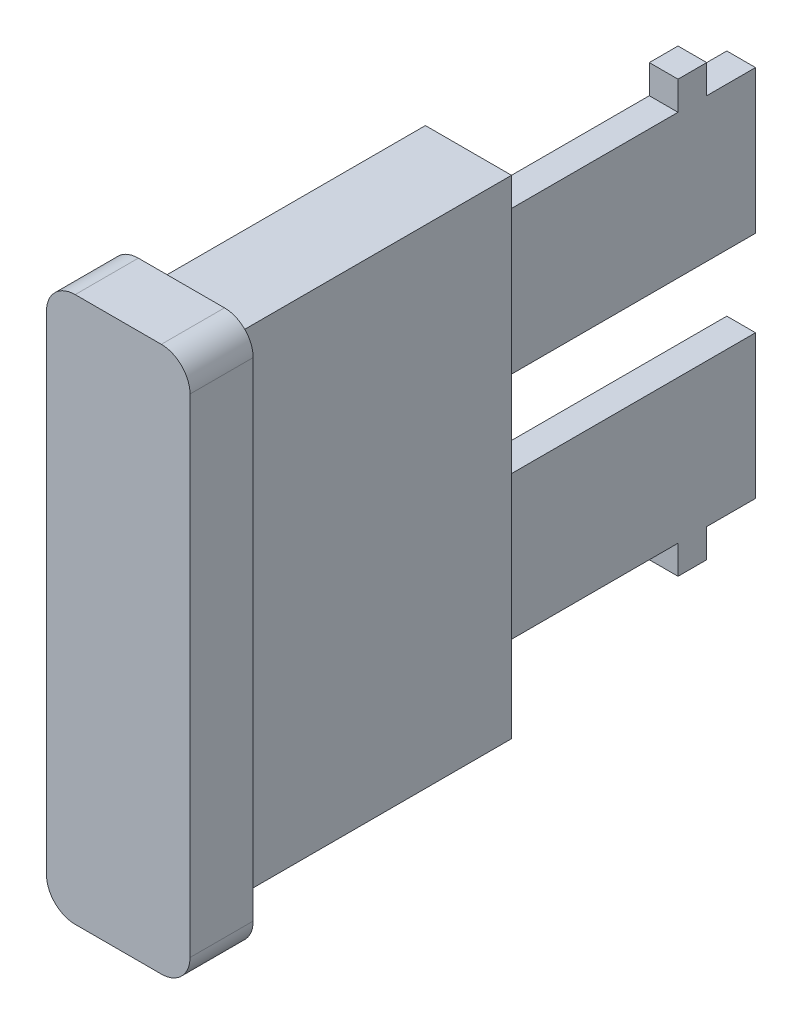
ISO-10303-21;
HEADER;
FILE_DESCRIPTION(('STEP AP214'),'2;1');
FILE_NAME('part.step','',(''),(''),'','','');
FILE_SCHEMA(('AUTOMOTIVE_DESIGN { 1 0 10303 214 1 1 1 1 }'));
ENDSEC;
DATA;
#1=APPLICATION_CONTEXT('core data for automotive mechanical design processes');
#2=APPLICATION_PROTOCOL_DEFINITION('international standard','automotive_design',2000,#1);
#3=PRODUCT_CONTEXT('',#1,'mechanical');
#4=PRODUCT('Part','Part','',(#3));
#5=PRODUCT_RELATED_PRODUCT_CATEGORY('part','',(#4));
#6=PRODUCT_DEFINITION_FORMATION('','',#4);
#7=PRODUCT_DEFINITION_CONTEXT('part definition',#1,'design');
#8=PRODUCT_DEFINITION('design','',#6,#7);
#9=PRODUCT_DEFINITION_SHAPE('','',#8);
#10=(LENGTH_UNIT() NAMED_UNIT(*) SI_UNIT(.MILLI.,.METRE.));
#11=(NAMED_UNIT(*) PLANE_ANGLE_UNIT() SI_UNIT($,.RADIAN.));
#12=(NAMED_UNIT(*) SI_UNIT($,.STERADIAN.) SOLID_ANGLE_UNIT());
#13=UNCERTAINTY_MEASURE_WITH_UNIT(LENGTH_MEASURE(1.E-05),#10,'distance_accuracy_value','');
#14=(GEOMETRIC_REPRESENTATION_CONTEXT(3) GLOBAL_UNCERTAINTY_ASSIGNED_CONTEXT((#13)) GLOBAL_UNIT_ASSIGNED_CONTEXT((#10,
#11,#12)) REPRESENTATION_CONTEXT('',''));
#15=CARTESIAN_POINT('',(0.,0.,0.));
#16=DIRECTION('',(0.,0.,1.));
#17=DIRECTION('',(1.,0.,0.));
#18=AXIS2_PLACEMENT_3D('',#15,#16,#17);
#19=CARTESIAN_POINT('',(-83.4015195369031,-101.205426917511,19.0000000000006));
#20=DIRECTION('',(0.,0.,1.));
#21=DIRECTION('',(1.,0.,0.));
#22=AXIS2_PLACEMENT_3D('',#19,#20,#21);
#23=CYLINDRICAL_SURFACE('',#22,1.);
#24=CARTESIAN_POINT('',(-83.4015195369031,-101.205426917511,16.8000000000006));
#25=DIRECTION('',(0.,0.,1.));
#26=DIRECTION('',(1.,0.,0.));
#27=AXIS2_PLACEMENT_3D('',#24,#25,#26);
#28=CIRCLE('',#27,1.);
#29=CARTESIAN_POINT('',(-82.4015195369031,-101.205426917511,16.8000000000006));
#30=VERTEX_POINT('',#29);
#31=CARTESIAN_POINT('',(-83.4015195369031,-100.205426917511,16.8000000000006));
#32=VERTEX_POINT('',#31);
#33=EDGE_CURVE('E20',#30,#32,#28,.T.);
#34=ORIENTED_EDGE('',*,*,#33,.T.);
#35=DIRECTION('',(0.,0.,-1.));
#36=VECTOR('',#35,1.);
#37=CARTESIAN_POINT('',(-83.4015195369031,-100.205426917511,19.0000000000006));
#38=LINE('',#37,#36);
#39=CARTESIAN_POINT('',(-83.4015195369031,-100.205426917511,19.0000000000006));
#40=VERTEX_POINT('',#39);
#41=EDGE_CURVE('E203',#32,#40,#38,.F.);
#42=ORIENTED_EDGE('',*,*,#41,.T.);
#43=CARTESIAN_POINT('',(-83.4015195369031,-101.205426917511,19.0000000000006));
#44=DIRECTION('',(0.,0.,1.));
#45=DIRECTION('',(1.,0.,0.));
#46=AXIS2_PLACEMENT_3D('',#43,#44,#45);
#47=CIRCLE('',#46,1.);
#48=CARTESIAN_POINT('',(-82.4015195369031,-101.205426917511,19.0000000000006));
#49=VERTEX_POINT('',#48);
#50=EDGE_CURVE('E370',#49,#40,#47,.T.);
#51=ORIENTED_EDGE('',*,*,#50,.F.);
#52=DIRECTION('',(0.,0.,1.));
#53=VECTOR('',#52,1.);
#54=CARTESIAN_POINT('',(-82.4015195369031,-101.205426917511,19.0000000000006));
#55=LINE('',#54,#53);
#56=EDGE_CURVE('E206',#49,#30,#55,.F.);
#57=ORIENTED_EDGE('',*,*,#56,.T.);
#58=EDGE_LOOP('',(#34,#42,#51,#57));
#59=FACE_BOUND('',#58,.T.);
#60=ADVANCED_FACE('F17',(#59),#23,.T.);
#61=CARTESIAN_POINT('',(-86.4015195369031,-101.205426917511,19.0000000000006));
#62=DIRECTION('',(0.,0.,1.));
#63=DIRECTION('',(1.,0.,0.));
#64=AXIS2_PLACEMENT_3D('',#61,#62,#63);
#65=CYLINDRICAL_SURFACE('',#64,1.);
#66=CARTESIAN_POINT('',(-86.4015195369031,-101.205426917511,16.8000000000006));
#67=DIRECTION('',(0.,0.,1.));
#68=DIRECTION('',(1.,0.,0.));
#69=AXIS2_PLACEMENT_3D('',#66,#67,#68);
#70=CIRCLE('',#69,1.);
#71=CARTESIAN_POINT('',(-86.4015195369031,-100.205426917511,16.8000000000006));
#72=VERTEX_POINT('',#71);
#73=CARTESIAN_POINT('',(-87.4015195369031,-101.205426917511,16.8000000000006));
#74=VERTEX_POINT('',#73);
#75=EDGE_CURVE('E208',#72,#74,#70,.T.);
#76=ORIENTED_EDGE('',*,*,#75,.T.);
#77=DIRECTION('',(0.,0.,-1.));
#78=VECTOR('',#77,1.);
#79=CARTESIAN_POINT('',(-87.4015195369031,-101.205426917511,19.0000000000006));
#80=LINE('',#79,#78);
#81=CARTESIAN_POINT('',(-87.4015195369031,-101.205426917511,19.0000000000006));
#82=VERTEX_POINT('',#81);
#83=EDGE_CURVE('E310',#74,#82,#80,.F.);
#84=ORIENTED_EDGE('',*,*,#83,.T.);
#85=CARTESIAN_POINT('',(-86.4015195369031,-101.205426917511,19.0000000000006));
#86=DIRECTION('',(0.,0.,1.));
#87=DIRECTION('',(1.,0.,0.));
#88=AXIS2_PLACEMENT_3D('',#85,#86,#87);
#89=CIRCLE('',#88,1.);
#90=CARTESIAN_POINT('',(-86.4015195369031,-100.205426917511,19.0000000000006));
#91=VERTEX_POINT('',#90);
#92=EDGE_CURVE('E360',#91,#82,#89,.T.);
#93=ORIENTED_EDGE('',*,*,#92,.F.);
#94=DIRECTION('',(0.,0.,-1.));
#95=VECTOR('',#94,1.);
#96=CARTESIAN_POINT('',(-86.4015195369031,-100.205426917511,19.0000000000006));
#97=LINE('',#96,#95);
#98=EDGE_CURVE('E313',#91,#72,#97,.T.);
#99=ORIENTED_EDGE('',*,*,#98,.T.);
#100=EDGE_LOOP('',(#76,#84,#93,#99));
#101=FACE_BOUND('',#100,.T.);
#102=ADVANCED_FACE('F383',(#101),#65,.T.);
#103=CARTESIAN_POINT('',(-83.4015195369031,-118.205426917511,19.0000000000006));
#104=DIRECTION('',(0.,0.,1.));
#105=DIRECTION('',(1.,0.,0.));
#106=AXIS2_PLACEMENT_3D('',#103,#104,#105);
#107=CYLINDRICAL_SURFACE('',#106,1.);
#108=CARTESIAN_POINT('',(-83.4015195369031,-118.205426917511,16.8000000000006));
#109=DIRECTION('',(0.,0.,1.));
#110=DIRECTION('',(1.,0.,0.));
#111=AXIS2_PLACEMENT_3D('',#108,#109,#110);
#112=CIRCLE('',#111,1.);
#113=CARTESIAN_POINT('',(-83.4015195369031,-119.205426917511,16.8000000000006));
#114=VERTEX_POINT('',#113);
#115=CARTESIAN_POINT('',(-82.4015195369031,-118.205426917511,16.8000000000006));
#116=VERTEX_POINT('',#115);
#117=EDGE_CURVE('E380',#114,#116,#112,.T.);
#118=ORIENTED_EDGE('',*,*,#117,.T.);
#119=DIRECTION('',(0.,0.,1.));
#120=VECTOR('',#119,1.);
#121=CARTESIAN_POINT('',(-82.4015195369031,-118.205426917511,19.0000000000006));
#122=LINE('',#121,#120);
#123=CARTESIAN_POINT('',(-82.4015195369031,-118.205426917511,19.0000000000006));
#124=VERTEX_POINT('',#123);
#125=EDGE_CURVE('E317',#116,#124,#122,.T.);
#126=ORIENTED_EDGE('',*,*,#125,.T.);
#127=CARTESIAN_POINT('',(-83.4015195369031,-118.205426917511,19.0000000000006));
#128=DIRECTION('',(0.,0.,1.));
#129=DIRECTION('',(1.,0.,0.));
#130=AXIS2_PLACEMENT_3D('',#127,#128,#129);
#131=CIRCLE('',#130,1.);
#132=CARTESIAN_POINT('',(-83.4015195369031,-119.205426917511,19.0000000000006));
#133=VERTEX_POINT('',#132);
#134=EDGE_CURVE('E372',#133,#124,#131,.T.);
#135=ORIENTED_EDGE('',*,*,#134,.F.);
#136=DIRECTION('',(0.,0.,1.));
#137=VECTOR('',#136,1.);
#138=CARTESIAN_POINT('',(-83.4015195369031,-119.205426917511,19.0000000000006));
#139=LINE('',#138,#137);
#140=EDGE_CURVE('E306',#133,#114,#139,.F.);
#141=ORIENTED_EDGE('',*,*,#140,.T.);
#142=EDGE_LOOP('',(#118,#126,#135,#141));
#143=FACE_BOUND('',#142,.T.);
#144=ADVANCED_FACE('F402',(#143),#107,.T.);
#145=CARTESIAN_POINT('',(-86.4015195369031,-118.205426917511,19.0000000000006));
#146=DIRECTION('',(0.,0.,1.));
#147=DIRECTION('',(1.,0.,0.));
#148=AXIS2_PLACEMENT_3D('',#145,#146,#147);
#149=CYLINDRICAL_SURFACE('',#148,1.);
#150=CARTESIAN_POINT('',(-86.4015195369031,-118.205426917511,16.8000000000006));
#151=DIRECTION('',(0.,0.,1.));
#152=DIRECTION('',(1.,0.,0.));
#153=AXIS2_PLACEMENT_3D('',#150,#151,#152);
#154=CIRCLE('',#153,1.);
#155=CARTESIAN_POINT('',(-87.4015195369031,-118.205426917511,16.8000000000006));
#156=VERTEX_POINT('',#155);
#157=CARTESIAN_POINT('',(-86.4015195369031,-119.205426917511,16.8000000000006));
#158=VERTEX_POINT('',#157);
#159=EDGE_CURVE('E378',#156,#158,#154,.T.);
#160=ORIENTED_EDGE('',*,*,#159,.T.);
#161=DIRECTION('',(0.,0.,1.));
#162=VECTOR('',#161,1.);
#163=CARTESIAN_POINT('',(-86.4015195369031,-119.205426917511,19.0000000000006));
#164=LINE('',#163,#162);
#165=CARTESIAN_POINT('',(-86.4015195369031,-119.205426917511,19.0000000000006));
#166=VERTEX_POINT('',#165);
#167=EDGE_CURVE('E304',#158,#166,#164,.T.);
#168=ORIENTED_EDGE('',*,*,#167,.T.);
#169=CARTESIAN_POINT('',(-86.4015195369031,-118.205426917511,19.0000000000006));
#170=DIRECTION('',(0.,0.,1.));
#171=DIRECTION('',(1.,0.,0.));
#172=AXIS2_PLACEMENT_3D('',#169,#170,#171);
#173=CIRCLE('',#172,1.);
#174=CARTESIAN_POINT('',(-87.4015195369031,-118.205426917511,19.0000000000006));
#175=VERTEX_POINT('',#174);
#176=EDGE_CURVE('E375',#175,#166,#173,.T.);
#177=ORIENTED_EDGE('',*,*,#176,.F.);
#178=DIRECTION('',(0.,0.,-1.));
#179=VECTOR('',#178,1.);
#180=CARTESIAN_POINT('',(-87.4015195369031,-118.205426917511,19.0000000000006));
#181=LINE('',#180,#179);
#182=EDGE_CURVE('E309',#175,#156,#181,.T.);
#183=ORIENTED_EDGE('',*,*,#182,.T.);
#184=EDGE_LOOP('',(#160,#168,#177,#183));
#185=FACE_BOUND('',#184,.T.);
#186=ADVANCED_FACE('F392',(#185),#149,.T.);
#187=CARTESIAN_POINT('',(-87.4015195369031,-100.205426917511,19.0000000000006));
#188=DIRECTION('',(0.,0.,1.));
#189=DIRECTION('',(1.,0.,0.));
#190=AXIS2_PLACEMENT_3D('',#187,#188,#189);
#191=PLANE('',#190);
#192=DIRECTION('',(1.,0.,0.));
#193=VECTOR('',#192,1.);
#194=CARTESIAN_POINT('',(-87.4015195369031,-100.205426917511,19.0000000000006));
#195=LINE('',#194,#193);
#196=EDGE_CURVE('E216',#40,#91,#195,.F.);
#197=ORIENTED_EDGE('',*,*,#196,.T.);
#198=ORIENTED_EDGE('',*,*,#92,.T.);
#199=DIRECTION('',(0.,1.,0.));
#200=VECTOR('',#199,1.);
#201=CARTESIAN_POINT('',(-87.4015195369031,-100.205426917511,19.0000000000006));
#202=LINE('',#201,#200);
#203=EDGE_CURVE('E312',#82,#175,#202,.F.);
#204=ORIENTED_EDGE('',*,*,#203,.T.);
#205=ORIENTED_EDGE('',*,*,#176,.T.);
#206=DIRECTION('',(1.,0.,0.));
#207=VECTOR('',#206,1.);
#208=CARTESIAN_POINT('',(-87.4015195369031,-119.205426917511,19.0000000000006));
#209=LINE('',#208,#207);
#210=EDGE_CURVE('E303',#166,#133,#209,.T.);
#211=ORIENTED_EDGE('',*,*,#210,.T.);
#212=ORIENTED_EDGE('',*,*,#134,.T.);
#213=DIRECTION('',(0.,-1.,0.));
#214=VECTOR('',#213,1.);
#215=CARTESIAN_POINT('',(-82.4015195369031,-100.205426917511,19.0000000000006));
#216=LINE('',#215,#214);
#217=EDGE_CURVE('E217',#124,#49,#216,.F.);
#218=ORIENTED_EDGE('',*,*,#217,.T.);
#219=ORIENTED_EDGE('',*,*,#50,.T.);
#220=EDGE_LOOP('',(#197,#198,#204,#205,#211,#212,#218,#219));
#221=FACE_BOUND('',#220,.T.);
#222=ADVANCED_FACE('F395',(#221),#191,.T.);
#223=CARTESIAN_POINT('',(-84.4015195369031,-108.205426917511,-2.69999999999945));
#224=DIRECTION('',(0.,1.,0.));
#225=DIRECTION('',(0.,0.,1.));
#226=AXIS2_PLACEMENT_3D('',#223,#224,#225);
#227=PLANE('',#226);
#228=DIRECTION('',(0.,0.,-1.));
#229=VECTOR('',#228,1.);
#230=CARTESIAN_POINT('',(-85.4015195369031,-108.205426917511,-2.69999999999945));
#231=LINE('',#230,#229);
#232=CARTESIAN_POINT('',(-85.4015195369031,-108.205426917511,6.80000000000055));
#233=VERTEX_POINT('',#232);
#234=CARTESIAN_POINT('',(-85.4015195369031,-108.205426917511,-2.69999999999945));
#235=VERTEX_POINT('',#234);
#236=EDGE_CURVE('E280',#233,#235,#231,.T.);
#237=ORIENTED_EDGE('',*,*,#236,.T.);
#238=DIRECTION('',(-1.,0.,0.));
#239=VECTOR('',#238,1.);
#240=CARTESIAN_POINT('',(-84.4015195369031,-108.205426917511,-2.69999999999945));
#241=LINE('',#240,#239);
#242=CARTESIAN_POINT('',(-84.4015195369031,-108.205426917511,-2.69999999999945));
#243=VERTEX_POINT('',#242);
#244=EDGE_CURVE('E355',#243,#235,#241,.T.);
#245=ORIENTED_EDGE('',*,*,#244,.F.);
#246=DIRECTION('',(0.,0.,1.));
#247=VECTOR('',#246,1.);
#248=CARTESIAN_POINT('',(-84.4015195369031,-108.205426917511,-2.69999999999945));
#249=LINE('',#248,#247);
#250=CARTESIAN_POINT('',(-84.4015195369031,-108.205426917511,6.80000000000055));
#251=VERTEX_POINT('',#250);
#252=EDGE_CURVE('E282',#243,#251,#249,.T.);
#253=ORIENTED_EDGE('',*,*,#252,.T.);
#254=DIRECTION('',(1.,0.,0.));
#255=VECTOR('',#254,1.);
#256=CARTESIAN_POINT('',(-84.4015195369031,-108.205426917511,6.80000000000055));
#257=LINE('',#256,#255);
#258=EDGE_CURVE('E358',#233,#251,#257,.T.);
#259=ORIENTED_EDGE('',*,*,#258,.F.);
#260=EDGE_LOOP('',(#237,#245,#253,#259));
#261=FACE_BOUND('',#260,.T.);
#262=ADVANCED_FACE('F495',(#261),#227,.F.);
#263=CARTESIAN_POINT('',(-84.4015195369031,-108.205426917511,-2.69999999999945));
#264=DIRECTION('',(0.,0.,-1.));
#265=DIRECTION('',(-1.,0.,0.));
#266=AXIS2_PLACEMENT_3D('',#263,#264,#265);
#267=PLANE('',#266);
#268=DIRECTION('',(0.,1.,0.));
#269=VECTOR('',#268,1.);
#270=CARTESIAN_POINT('',(-85.4015195369031,-103.205426917511,-2.69999999999945));
#271=LINE('',#270,#269);
#272=CARTESIAN_POINT('',(-85.4015195369031,-103.205426917511,-2.69999999999945));
#273=VERTEX_POINT('',#272);
#274=EDGE_CURVE('E278',#235,#273,#271,.T.);
#275=ORIENTED_EDGE('',*,*,#274,.T.);
#276=DIRECTION('',(1.,0.,0.));
#277=VECTOR('',#276,1.);
#278=CARTESIAN_POINT('',(-84.4015195369031,-103.205426917511,-2.69999999999945));
#279=LINE('',#278,#277);
#280=CARTESIAN_POINT('',(-84.4015195369031,-103.205426917511,-2.69999999999945));
#281=VERTEX_POINT('',#280);
#282=EDGE_CURVE('E353',#273,#281,#279,.T.);
#283=ORIENTED_EDGE('',*,*,#282,.T.);
#284=DIRECTION('',(0.,1.,0.));
#285=VECTOR('',#284,1.);
#286=CARTESIAN_POINT('',(-84.4015195369031,-103.205426917511,-2.69999999999945));
#287=LINE('',#286,#285);
#288=EDGE_CURVE('E285',#281,#243,#287,.F.);
#289=ORIENTED_EDGE('',*,*,#288,.T.);
#290=ORIENTED_EDGE('',*,*,#244,.T.);
#291=EDGE_LOOP('',(#275,#283,#289,#290));
#292=FACE_BOUND('',#291,.T.);
#293=ADVANCED_FACE('F497',(#292),#267,.T.);
#294=CARTESIAN_POINT('',(-84.4015195369031,-103.205426917511,-2.69999999999945));
#295=DIRECTION('',(0.,-1.,0.));
#296=DIRECTION('',(0.,0.,-1.));
#297=AXIS2_PLACEMENT_3D('',#294,#295,#296);
#298=PLANE('',#297);
#299=DIRECTION('',(-1.,0.,0.));
#300=VECTOR('',#299,1.);
#301=CARTESIAN_POINT('',(-86.8157330992762,-103.205426917511,-0.999999999999449));
#302=LINE('',#301,#300);
#303=CARTESIAN_POINT('',(-84.4015195369031,-103.205426917511,-0.999999999999449));
#304=VERTEX_POINT('',#303);
#305=CARTESIAN_POINT('',(-85.4015195369031,-103.205426917511,-0.999999999999449));
#306=VERTEX_POINT('',#305);
#307=EDGE_CURVE('E350',#304,#306,#302,.T.);
#308=ORIENTED_EDGE('',*,*,#307,.F.);
#309=DIRECTION('',(0.,0.,1.));
#310=VECTOR('',#309,1.);
#311=CARTESIAN_POINT('',(-84.4015195369031,-103.205426917511,-2.69999999999945));
#312=LINE('',#311,#310);
#313=EDGE_CURVE('E288',#304,#281,#312,.F.);
#314=ORIENTED_EDGE('',*,*,#313,.T.);
#315=ORIENTED_EDGE('',*,*,#282,.F.);
#316=DIRECTION('',(0.,0.,-1.));
#317=VECTOR('',#316,1.);
#318=CARTESIAN_POINT('',(-85.4015195369031,-103.205426917511,-2.69999999999945));
#319=LINE('',#318,#317);
#320=EDGE_CURVE('E276',#273,#306,#319,.F.);
#321=ORIENTED_EDGE('',*,*,#320,.T.);
#322=EDGE_LOOP('',(#308,#314,#315,#321));
#323=FACE_BOUND('',#322,.T.);
#324=ADVANCED_FACE('F516',(#323),#298,.F.);
#325=CARTESIAN_POINT('',(-86.8157330992762,-103.205426917511,-0.999999999999449));
#326=DIRECTION('',(0.,0.,-1.));
#327=DIRECTION('',(-1.,0.,0.));
#328=AXIS2_PLACEMENT_3D('',#325,#326,#327);
#329=PLANE('',#328);
#330=DIRECTION('',(0.,1.,0.));
#331=VECTOR('',#330,1.);
#332=CARTESIAN_POINT('',(-84.4015195369031,-103.205426917511,-0.999999999999449));
#333=LINE('',#332,#331);
#334=CARTESIAN_POINT('',(-84.4015195369031,-102.205426917511,-0.999999999999449));
#335=VERTEX_POINT('',#334);
#336=EDGE_CURVE('E291',#335,#304,#333,.F.);
#337=ORIENTED_EDGE('',*,*,#336,.T.);
#338=ORIENTED_EDGE('',*,*,#307,.T.);
#339=DIRECTION('',(0.,1.,0.));
#340=VECTOR('',#339,1.);
#341=CARTESIAN_POINT('',(-85.4015195369031,-103.205426917511,-0.999999999999449));
#342=LINE('',#341,#340);
#343=CARTESIAN_POINT('',(-85.4015195369031,-102.205426917511,-0.999999999999449));
#344=VERTEX_POINT('',#343);
#345=EDGE_CURVE('E274',#306,#344,#342,.T.);
#346=ORIENTED_EDGE('',*,*,#345,.T.);
#347=DIRECTION('',(1.,0.,0.));
#348=VECTOR('',#347,1.);
#349=CARTESIAN_POINT('',(-86.8157330992762,-102.205426917511,-0.999999999999449));
#350=LINE('',#349,#348);
#351=EDGE_CURVE('E347',#335,#344,#350,.F.);
#352=ORIENTED_EDGE('',*,*,#351,.F.);
#353=EDGE_LOOP('',(#337,#338,#346,#352));
#354=FACE_BOUND('',#353,.T.);
#355=ADVANCED_FACE('F514',(#354),#329,.T.);
#356=CARTESIAN_POINT('',(-86.8157330992762,-102.205426917511,5.51642065360625E-13));
#357=DIRECTION('',(0.,1.,0.));
#358=DIRECTION('',(0.,0.,1.));
#359=AXIS2_PLACEMENT_3D('',#356,#357,#358);
#360=PLANE('',#359);
#361=DIRECTION('',(0.,0.,1.));
#362=VECTOR('',#361,1.);
#363=CARTESIAN_POINT('',(-84.4015195369031,-102.205426917511,-2.69999999999945));
#364=LINE('',#363,#362);
#365=CARTESIAN_POINT('',(-84.4015195369031,-102.205426917511,5.52509427098613E-13));
#366=VERTEX_POINT('',#365);
#367=EDGE_CURVE('E294',#366,#335,#364,.F.);
#368=ORIENTED_EDGE('',*,*,#367,.T.);
#369=ORIENTED_EDGE('',*,*,#351,.T.);
#370=DIRECTION('',(0.,0.,-1.));
#371=VECTOR('',#370,1.);
#372=CARTESIAN_POINT('',(-85.4015195369031,-102.205426917511,-2.69999999999945));
#373=LINE('',#372,#371);
#374=CARTESIAN_POINT('',(-85.4015195369031,-102.205426917511,5.51642065360625E-13));
#375=VERTEX_POINT('',#374);
#376=EDGE_CURVE('E272',#344,#375,#373,.F.);
#377=ORIENTED_EDGE('',*,*,#376,.T.);
#378=DIRECTION('',(1.,0.,0.));
#379=VECTOR('',#378,1.);
#380=CARTESIAN_POINT('',(-86.8157330992762,-102.205426917511,5.51642065360624E-13));
#381=LINE('',#380,#379);
#382=EDGE_CURVE('E344',#366,#375,#381,.F.);
#383=ORIENTED_EDGE('',*,*,#382,.F.);
#384=EDGE_LOOP('',(#368,#369,#377,#383));
#385=FACE_BOUND('',#384,.T.);
#386=ADVANCED_FACE('F512',(#385),#360,.T.);
#387=CARTESIAN_POINT('',(-86.8157330992762,-103.205426917511,5.55111512312578E-13));
#388=DIRECTION('',(0.,0.,1.));
#389=DIRECTION('',(0.,-1.,0.));
#390=AXIS2_PLACEMENT_3D('',#387,#388,#389);
#391=PLANE('',#390);
#392=DIRECTION('',(0.,1.,0.));
#393=VECTOR('',#392,1.);
#394=CARTESIAN_POINT('',(-84.4015195369031,-103.205426917511,5.55111512312578E-13));
#395=LINE('',#394,#393);
#396=CARTESIAN_POINT('',(-84.4015195369031,-103.205426917511,5.55111512312578E-13));
#397=VERTEX_POINT('',#396);
#398=EDGE_CURVE('E297',#397,#366,#395,.T.);
#399=ORIENTED_EDGE('',*,*,#398,.T.);
#400=ORIENTED_EDGE('',*,*,#382,.T.);
#401=DIRECTION('',(0.,1.,0.));
#402=VECTOR('',#401,1.);
#403=CARTESIAN_POINT('',(-85.4015195369031,-103.205426917511,5.51642065360625E-13));
#404=LINE('',#403,#402);
#405=CARTESIAN_POINT('',(-85.4015195369031,-103.205426917511,5.5424415057459E-13));
#406=VERTEX_POINT('',#405);
#407=EDGE_CURVE('E270',#375,#406,#404,.F.);
#408=ORIENTED_EDGE('',*,*,#407,.T.);
#409=DIRECTION('',(1.,0.,0.));
#410=VECTOR('',#409,1.);
#411=CARTESIAN_POINT('',(-84.4015195369031,-103.205426917511,5.55111512312578E-13));
#412=LINE('',#411,#410);
#413=EDGE_CURVE('E340',#406,#397,#412,.T.);
#414=ORIENTED_EDGE('',*,*,#413,.T.);
#415=EDGE_LOOP('',(#399,#400,#408,#414));
#416=FACE_BOUND('',#415,.T.);
#417=ADVANCED_FACE('F508',(#416),#391,.T.);
#418=CARTESIAN_POINT('',(-84.4015195369031,-103.205426917511,-2.69999999999945));
#419=DIRECTION('',(0.,-1.,0.));
#420=DIRECTION('',(0.,0.,-1.));
#421=AXIS2_PLACEMENT_3D('',#418,#419,#420);
#422=PLANE('',#421);
#423=ORIENTED_EDGE('',*,*,#413,.F.);
#424=DIRECTION('',(0.,0.,-1.));
#425=VECTOR('',#424,1.);
#426=CARTESIAN_POINT('',(-85.4015195369031,-103.205426917511,-2.69999999999945));
#427=LINE('',#426,#425);
#428=CARTESIAN_POINT('',(-85.4015195369031,-103.205426917511,6.80000000000055));
#429=VERTEX_POINT('',#428);
#430=EDGE_CURVE('E267',#406,#429,#427,.F.);
#431=ORIENTED_EDGE('',*,*,#430,.T.);
#432=DIRECTION('',(1.,0.,0.));
#433=VECTOR('',#432,1.);
#434=CARTESIAN_POINT('',(-84.4015195369031,-103.205426917511,6.80000000000055));
#435=LINE('',#434,#433);
#436=CARTESIAN_POINT('',(-84.4015195369031,-103.205426917511,6.80000000000055));
#437=VERTEX_POINT('',#436);
#438=EDGE_CURVE('E342',#437,#429,#435,.F.);
#439=ORIENTED_EDGE('',*,*,#438,.F.);
#440=DIRECTION('',(0.,0.,1.));
#441=VECTOR('',#440,1.);
#442=CARTESIAN_POINT('',(-84.4015195369031,-103.205426917511,-2.69999999999945));
#443=LINE('',#442,#441);
#444=EDGE_CURVE('E300',#437,#397,#443,.F.);
#445=ORIENTED_EDGE('',*,*,#444,.T.);
#446=EDGE_LOOP('',(#423,#431,#439,#445));
#447=FACE_BOUND('',#446,.T.);
#448=ADVANCED_FACE('F487',(#447),#422,.F.);
#449=CARTESIAN_POINT('',(-84.4015195369031,-116.205426917511,-2.69999999999945));
#450=DIRECTION('',(0.,1.,0.));
#451=DIRECTION('',(0.,0.,1.));
#452=AXIS2_PLACEMENT_3D('',#449,#450,#451);
#453=PLANE('',#452);
#454=DIRECTION('',(1.,0.,0.));
#455=VECTOR('',#454,1.);
#456=CARTESIAN_POINT('',(-86.8157330992762,-116.205426917511,5.55111512312578E-13));
#457=LINE('',#456,#455);
#458=CARTESIAN_POINT('',(-84.4015195369031,-116.205426917511,5.5424415057459E-13));
#459=VERTEX_POINT('',#458);
#460=CARTESIAN_POINT('',(-85.4015195369031,-116.205426917511,5.55111512312578E-13));
#461=VERTEX_POINT('',#460);
#462=EDGE_CURVE('E335',#459,#461,#457,.F.);
#463=ORIENTED_EDGE('',*,*,#462,.F.);
#464=DIRECTION('',(0.,0.,1.));
#465=VECTOR('',#464,1.);
#466=CARTESIAN_POINT('',(-84.4015195369031,-116.205426917511,-2.69999999999945));
#467=LINE('',#466,#465);
#468=CARTESIAN_POINT('',(-84.4015195369031,-116.205426917511,6.80000000000055));
#469=VERTEX_POINT('',#468);
#470=EDGE_CURVE('E246',#459,#469,#467,.T.);
#471=ORIENTED_EDGE('',*,*,#470,.T.);
#472=DIRECTION('',(1.,0.,0.));
#473=VECTOR('',#472,1.);
#474=CARTESIAN_POINT('',(-84.4015195369031,-116.205426917511,6.80000000000055));
#475=LINE('',#474,#473);
#476=CARTESIAN_POINT('',(-85.4015195369031,-116.205426917511,6.80000000000055));
#477=VERTEX_POINT('',#476);
#478=EDGE_CURVE('E338',#477,#469,#475,.T.);
#479=ORIENTED_EDGE('',*,*,#478,.F.);
#480=DIRECTION('',(0.,0.,-1.));
#481=VECTOR('',#480,1.);
#482=CARTESIAN_POINT('',(-85.4015195369031,-116.205426917511,-2.69999999999945));
#483=LINE('',#482,#481);
#484=EDGE_CURVE('E244',#477,#461,#483,.T.);
#485=ORIENTED_EDGE('',*,*,#484,.T.);
#486=EDGE_LOOP('',(#463,#471,#479,#485));
#487=FACE_BOUND('',#486,.T.);
#488=ADVANCED_FACE('F613',(#487),#453,.F.);
#489=CARTESIAN_POINT('',(-86.8157330992762,-116.205426917511,5.55111512312578E-13));
#490=DIRECTION('',(0.,0.,1.));
#491=DIRECTION('',(0.,-1.,0.));
#492=AXIS2_PLACEMENT_3D('',#489,#490,#491);
#493=PLANE('',#492);
#494=DIRECTION('',(0.,1.,0.));
#495=VECTOR('',#494,1.);
#496=CARTESIAN_POINT('',(-84.4015195369031,-111.205426917511,5.51642065360625E-13));
#497=LINE('',#496,#495);
#498=CARTESIAN_POINT('',(-84.4015195369031,-117.205426917511,5.51642065360625E-13));
#499=VERTEX_POINT('',#498);
#500=EDGE_CURVE('E249',#499,#459,#497,.T.);
#501=ORIENTED_EDGE('',*,*,#500,.T.);
#502=ORIENTED_EDGE('',*,*,#462,.T.);
#503=DIRECTION('',(0.,1.,0.));
#504=VECTOR('',#503,1.);
#505=CARTESIAN_POINT('',(-85.4015195369031,-111.205426917511,5.55111512312578E-13));
#506=LINE('',#505,#504);
#507=CARTESIAN_POINT('',(-85.4015195369031,-117.205426917511,5.52509427098613E-13));
#508=VERTEX_POINT('',#507);
#509=EDGE_CURVE('E242',#461,#508,#506,.F.);
#510=ORIENTED_EDGE('',*,*,#509,.T.);
#511=DIRECTION('',(1.,0.,0.));
#512=VECTOR('',#511,1.);
#513=CARTESIAN_POINT('',(-86.8157330992762,-117.205426917511,5.51642065360625E-13));
#514=LINE('',#513,#512);
#515=EDGE_CURVE('E332',#499,#508,#514,.F.);
#516=ORIENTED_EDGE('',*,*,#515,.F.);
#517=EDGE_LOOP('',(#501,#502,#510,#516));
#518=FACE_BOUND('',#517,.T.);
#519=ADVANCED_FACE('F622',(#518),#493,.T.);
#520=CARTESIAN_POINT('',(-86.8157330992762,-117.205426917511,5.51642065360625E-13));
#521=DIRECTION('',(0.,-1.,0.));
#522=DIRECTION('',(0.,0.,-1.));
#523=AXIS2_PLACEMENT_3D('',#520,#521,#522);
#524=PLANE('',#523);
#525=DIRECTION('',(0.,0.,1.));
#526=VECTOR('',#525,1.);
#527=CARTESIAN_POINT('',(-84.4015195369031,-117.205426917511,-2.69999999999945));
#528=LINE('',#527,#526);
#529=CARTESIAN_POINT('',(-84.4015195369031,-117.205426917511,-0.999999999999449));
#530=VERTEX_POINT('',#529);
#531=EDGE_CURVE('E252',#530,#499,#528,.T.);
#532=ORIENTED_EDGE('',*,*,#531,.T.);
#533=ORIENTED_EDGE('',*,*,#515,.T.);
#534=DIRECTION('',(0.,0.,-1.));
#535=VECTOR('',#534,1.);
#536=CARTESIAN_POINT('',(-85.4015195369031,-117.205426917511,-2.69999999999945));
#537=LINE('',#536,#535);
#538=CARTESIAN_POINT('',(-85.4015195369031,-117.205426917511,-0.999999999999449));
#539=VERTEX_POINT('',#538);
#540=EDGE_CURVE('E240',#508,#539,#537,.T.);
#541=ORIENTED_EDGE('',*,*,#540,.T.);
#542=DIRECTION('',(-1.,0.,0.));
#543=VECTOR('',#542,1.);
#544=CARTESIAN_POINT('',(-86.8157330992762,-117.205426917511,-0.999999999999449));
#545=LINE('',#544,#543);
#546=EDGE_CURVE('E329',#530,#539,#545,.T.);
#547=ORIENTED_EDGE('',*,*,#546,.F.);
#548=EDGE_LOOP('',(#532,#533,#541,#547));
#549=FACE_BOUND('',#548,.T.);
#550=ADVANCED_FACE('F632',(#549),#524,.T.);
#551=CARTESIAN_POINT('',(-86.8157330992762,-116.205426917511,-0.999999999999449));
#552=DIRECTION('',(0.,0.,-1.));
#553=DIRECTION('',(-1.,0.,0.));
#554=AXIS2_PLACEMENT_3D('',#551,#552,#553);
#555=PLANE('',#554);
#556=DIRECTION('',(0.,1.,0.));
#557=VECTOR('',#556,1.);
#558=CARTESIAN_POINT('',(-84.4015195369031,-111.205426917511,-0.999999999999449));
#559=LINE('',#558,#557);
#560=CARTESIAN_POINT('',(-84.4015195369031,-116.205426917511,-0.999999999999449));
#561=VERTEX_POINT('',#560);
#562=EDGE_CURVE('E255',#561,#530,#559,.F.);
#563=ORIENTED_EDGE('',*,*,#562,.T.);
#564=ORIENTED_EDGE('',*,*,#546,.T.);
#565=DIRECTION('',(0.,1.,0.));
#566=VECTOR('',#565,1.);
#567=CARTESIAN_POINT('',(-85.4015195369031,-111.205426917511,-0.999999999999449));
#568=LINE('',#567,#566);
#569=CARTESIAN_POINT('',(-85.4015195369031,-116.205426917511,-0.999999999999449));
#570=VERTEX_POINT('',#569);
#571=EDGE_CURVE('E238',#539,#570,#568,.T.);
#572=ORIENTED_EDGE('',*,*,#571,.T.);
#573=DIRECTION('',(1.,0.,0.));
#574=VECTOR('',#573,1.);
#575=CARTESIAN_POINT('',(-84.4015195369031,-116.205426917511,-0.999999999999449));
#576=LINE('',#575,#574);
#577=EDGE_CURVE('E327',#570,#561,#576,.T.);
#578=ORIENTED_EDGE('',*,*,#577,.T.);
#579=EDGE_LOOP('',(#563,#564,#572,#578));
#580=FACE_BOUND('',#579,.T.);
#581=ADVANCED_FACE('F642',(#580),#555,.T.);
#582=CARTESIAN_POINT('',(-84.4015195369031,-116.205426917511,-2.69999999999945));
#583=DIRECTION('',(0.,1.,0.));
#584=DIRECTION('',(0.,0.,1.));
#585=AXIS2_PLACEMENT_3D('',#582,#583,#584);
#586=PLANE('',#585);
#587=ORIENTED_EDGE('',*,*,#577,.F.);
#588=DIRECTION('',(0.,0.,-1.));
#589=VECTOR('',#588,1.);
#590=CARTESIAN_POINT('',(-85.4015195369031,-116.205426917511,-2.69999999999945));
#591=LINE('',#590,#589);
#592=CARTESIAN_POINT('',(-85.4015195369031,-116.205426917511,-2.69999999999945));
#593=VERTEX_POINT('',#592);
#594=EDGE_CURVE('E236',#570,#593,#591,.T.);
#595=ORIENTED_EDGE('',*,*,#594,.T.);
#596=DIRECTION('',(-1.,0.,0.));
#597=VECTOR('',#596,1.);
#598=CARTESIAN_POINT('',(-84.4015195369031,-116.205426917511,-2.69999999999945));
#599=LINE('',#598,#597);
#600=CARTESIAN_POINT('',(-84.4015195369031,-116.205426917511,-2.69999999999945));
#601=VERTEX_POINT('',#600);
#602=EDGE_CURVE('E324',#601,#593,#599,.T.);
#603=ORIENTED_EDGE('',*,*,#602,.F.);
#604=DIRECTION('',(0.,0.,1.));
#605=VECTOR('',#604,1.);
#606=CARTESIAN_POINT('',(-84.4015195369031,-116.205426917511,-2.69999999999945));
#607=LINE('',#606,#605);
#608=EDGE_CURVE('E258',#601,#561,#607,.T.);
#609=ORIENTED_EDGE('',*,*,#608,.T.);
#610=EDGE_LOOP('',(#587,#595,#603,#609));
#611=FACE_BOUND('',#610,.T.);
#612=ADVANCED_FACE('F652',(#611),#586,.F.);
#613=CARTESIAN_POINT('',(-84.4015195369031,-111.205426917511,-2.69999999999945));
#614=DIRECTION('',(0.,0.,-1.));
#615=DIRECTION('',(-1.,0.,0.));
#616=AXIS2_PLACEMENT_3D('',#613,#614,#615);
#617=PLANE('',#616);
#618=DIRECTION('',(0.,1.,0.));
#619=VECTOR('',#618,1.);
#620=CARTESIAN_POINT('',(-85.4015195369031,-111.205426917511,-2.69999999999945));
#621=LINE('',#620,#619);
#622=CARTESIAN_POINT('',(-85.4015195369031,-111.205426917511,-2.69999999999945));
#623=VERTEX_POINT('',#622);
#624=EDGE_CURVE('E234',#593,#623,#621,.T.);
#625=ORIENTED_EDGE('',*,*,#624,.T.);
#626=DIRECTION('',(1.,0.,0.));
#627=VECTOR('',#626,1.);
#628=CARTESIAN_POINT('',(-84.4015195369031,-111.205426917511,-2.69999999999945));
#629=LINE('',#628,#627);
#630=CARTESIAN_POINT('',(-84.4015195369031,-111.205426917511,-2.69999999999945));
#631=VERTEX_POINT('',#630);
#632=EDGE_CURVE('E322',#623,#631,#629,.T.);
#633=ORIENTED_EDGE('',*,*,#632,.T.);
#634=DIRECTION('',(0.,1.,0.));
#635=VECTOR('',#634,1.);
#636=CARTESIAN_POINT('',(-84.4015195369031,-111.205426917511,-2.69999999999945));
#637=LINE('',#636,#635);
#638=EDGE_CURVE('E261',#631,#601,#637,.F.);
#639=ORIENTED_EDGE('',*,*,#638,.T.);
#640=ORIENTED_EDGE('',*,*,#602,.T.);
#641=EDGE_LOOP('',(#625,#633,#639,#640));
#642=FACE_BOUND('',#641,.T.);
#643=ADVANCED_FACE('F662',(#642),#617,.T.);
#644=CARTESIAN_POINT('',(-84.4015195369031,-111.205426917511,-2.69999999999945));
#645=DIRECTION('',(0.,-1.,0.));
#646=DIRECTION('',(0.,0.,-1.));
#647=AXIS2_PLACEMENT_3D('',#644,#645,#646);
#648=PLANE('',#647);
#649=DIRECTION('',(0.,0.,1.));
#650=VECTOR('',#649,1.);
#651=CARTESIAN_POINT('',(-84.4015195369031,-111.205426917511,-2.69999999999945));
#652=LINE('',#651,#650);
#653=CARTESIAN_POINT('',(-84.4015195369031,-111.205426917511,6.80000000000055));
#654=VERTEX_POINT('',#653);
#655=EDGE_CURVE('E264',#654,#631,#652,.F.);
#656=ORIENTED_EDGE('',*,*,#655,.T.);
#657=ORIENTED_EDGE('',*,*,#632,.F.);
#658=DIRECTION('',(0.,0.,-1.));
#659=VECTOR('',#658,1.);
#660=CARTESIAN_POINT('',(-85.4015195369031,-111.205426917511,-2.69999999999945));
#661=LINE('',#660,#659);
#662=CARTESIAN_POINT('',(-85.4015195369031,-111.205426917511,6.80000000000055));
#663=VERTEX_POINT('',#662);
#664=EDGE_CURVE('E228',#623,#663,#661,.F.);
#665=ORIENTED_EDGE('',*,*,#664,.T.);
#666=DIRECTION('',(1.,0.,0.));
#667=VECTOR('',#666,1.);
#668=CARTESIAN_POINT('',(-84.4015195369031,-111.205426917511,6.80000000000055));
#669=LINE('',#668,#667);
#670=EDGE_CURVE('E320',#654,#663,#669,.F.);
#671=ORIENTED_EDGE('',*,*,#670,.F.);
#672=EDGE_LOOP('',(#656,#657,#665,#671));
#673=FACE_BOUND('',#672,.T.);
#674=ADVANCED_FACE('F672',(#673),#648,.F.);
#675=CARTESIAN_POINT('',(-82.4015195369031,-100.205426917511,19.0000000000006));
#676=DIRECTION('',(-1.,0.,0.));
#677=DIRECTION('',(0.,-1.,0.));
#678=AXIS2_PLACEMENT_3D('',#675,#676,#677);
#679=PLANE('',#678);
#680=ORIENTED_EDGE('',*,*,#125,.F.);
#681=DIRECTION('',(0.,1.,0.));
#682=VECTOR('',#681,1.);
#683=CARTESIAN_POINT('',(-82.4015195369031,-100.205426917511,16.8000000000006));
#684=LINE('',#683,#682);
#685=EDGE_CURVE('E223',#116,#30,#684,.T.);
#686=ORIENTED_EDGE('',*,*,#685,.T.);
#687=ORIENTED_EDGE('',*,*,#56,.F.);
#688=ORIENTED_EDGE('',*,*,#217,.F.);
#689=EDGE_LOOP('',(#680,#686,#687,#688));
#690=FACE_BOUND('',#689,.T.);
#691=ADVANCED_FACE('F399',(#690),#679,.F.);
#692=CARTESIAN_POINT('',(-87.4015195369031,-100.205426917511,19.0000000000006));
#693=DIRECTION('',(0.,-1.,0.));
#694=DIRECTION('',(0.,0.,-1.));
#695=AXIS2_PLACEMENT_3D('',#692,#693,#694);
#696=PLANE('',#695);
#697=ORIENTED_EDGE('',*,*,#98,.F.);
#698=ORIENTED_EDGE('',*,*,#196,.F.);
#699=ORIENTED_EDGE('',*,*,#41,.F.);
#700=DIRECTION('',(1.,0.,0.));
#701=VECTOR('',#700,1.);
#702=CARTESIAN_POINT('',(-87.4015195369031,-100.205426917511,16.8000000000006));
#703=LINE('',#702,#701);
#704=EDGE_CURVE('E214',#32,#72,#703,.F.);
#705=ORIENTED_EDGE('',*,*,#704,.T.);
#706=EDGE_LOOP('',(#697,#698,#699,#705));
#707=FACE_BOUND('',#706,.T.);
#708=ADVANCED_FACE('F213',(#707),#696,.F.);
#709=CARTESIAN_POINT('',(-87.4015195369031,-100.205426917511,19.0000000000006));
#710=DIRECTION('',(1.,0.,0.));
#711=DIRECTION('',(0.,0.,-1.));
#712=AXIS2_PLACEMENT_3D('',#709,#710,#711);
#713=PLANE('',#712);
#714=ORIENTED_EDGE('',*,*,#182,.F.);
#715=ORIENTED_EDGE('',*,*,#203,.F.);
#716=ORIENTED_EDGE('',*,*,#83,.F.);
#717=DIRECTION('',(0.,1.,0.));
#718=VECTOR('',#717,1.);
#719=CARTESIAN_POINT('',(-87.4015195369031,-100.205426917511,16.8000000000006));
#720=LINE('',#719,#718);
#721=EDGE_CURVE('E222',#74,#156,#720,.F.);
#722=ORIENTED_EDGE('',*,*,#721,.T.);
#723=EDGE_LOOP('',(#714,#715,#716,#722));
#724=FACE_BOUND('',#723,.T.);
#725=ADVANCED_FACE('F387',(#724),#713,.F.);
#726=CARTESIAN_POINT('',(-87.4015195369031,-119.205426917511,19.0000000000006));
#727=DIRECTION('',(0.,1.,0.));
#728=DIRECTION('',(0.,0.,1.));
#729=AXIS2_PLACEMENT_3D('',#726,#727,#728);
#730=PLANE('',#729);
#731=ORIENTED_EDGE('',*,*,#167,.F.);
#732=DIRECTION('',(1.,0.,0.));
#733=VECTOR('',#732,1.);
#734=CARTESIAN_POINT('',(-87.4015195369031,-119.205426917511,16.8000000000006));
#735=LINE('',#734,#733);
#736=EDGE_CURVE('E226',#158,#114,#735,.T.);
#737=ORIENTED_EDGE('',*,*,#736,.T.);
#738=ORIENTED_EDGE('',*,*,#140,.F.);
#739=ORIENTED_EDGE('',*,*,#210,.F.);
#740=EDGE_LOOP('',(#731,#737,#738,#739));
#741=FACE_BOUND('',#740,.T.);
#742=ADVANCED_FACE('F404',(#741),#730,.F.);
#743=CARTESIAN_POINT('',(-84.4015195369031,-103.205426917511,-2.69999999999945));
#744=DIRECTION('',(-1.,0.,0.));
#745=DIRECTION('',(0.,0.,1.));
#746=AXIS2_PLACEMENT_3D('',#743,#744,#745);
#747=PLANE('',#746);
#748=ORIENTED_EDGE('',*,*,#252,.F.);
#749=ORIENTED_EDGE('',*,*,#288,.F.);
#750=ORIENTED_EDGE('',*,*,#313,.F.);
#751=ORIENTED_EDGE('',*,*,#336,.F.);
#752=ORIENTED_EDGE('',*,*,#367,.F.);
#753=ORIENTED_EDGE('',*,*,#398,.F.);
#754=ORIENTED_EDGE('',*,*,#444,.F.);
#755=DIRECTION('',(0.,1.,0.));
#756=VECTOR('',#755,1.);
#757=CARTESIAN_POINT('',(-84.4015195369031,-101.205426917511,6.80000000000055));
#758=LINE('',#757,#756);
#759=EDGE_CURVE('E418',#251,#437,#758,.T.);
#760=ORIENTED_EDGE('',*,*,#759,.F.);
#761=EDGE_LOOP('',(#748,#749,#750,#751,#752,#753,#754,#760));
#762=FACE_BOUND('',#761,.T.);
#763=ADVANCED_FACE('F503',(#762),#747,.F.);
#764=CARTESIAN_POINT('',(-85.4015195369031,-103.205426917511,-2.69999999999945));
#765=DIRECTION('',(1.,0.,0.));
#766=DIRECTION('',(0.,0.,-1.));
#767=AXIS2_PLACEMENT_3D('',#764,#765,#766);
#768=PLANE('',#767);
#769=ORIENTED_EDGE('',*,*,#430,.F.);
#770=ORIENTED_EDGE('',*,*,#407,.F.);
#771=ORIENTED_EDGE('',*,*,#376,.F.);
#772=ORIENTED_EDGE('',*,*,#345,.F.);
#773=ORIENTED_EDGE('',*,*,#320,.F.);
#774=ORIENTED_EDGE('',*,*,#274,.F.);
#775=ORIENTED_EDGE('',*,*,#236,.F.);
#776=DIRECTION('',(0.,1.,0.));
#777=VECTOR('',#776,1.);
#778=CARTESIAN_POINT('',(-85.4015195369031,-101.205426917511,6.80000000000055));
#779=LINE('',#778,#777);
#780=EDGE_CURVE('E421',#429,#233,#779,.F.);
#781=ORIENTED_EDGE('',*,*,#780,.F.);
#782=EDGE_LOOP('',(#769,#770,#771,#772,#773,#774,#775,#781));
#783=FACE_BOUND('',#782,.T.);
#784=ADVANCED_FACE('F491',(#783),#768,.F.);
#785=CARTESIAN_POINT('',(-84.4015195369031,-111.205426917511,-2.69999999999945));
#786=DIRECTION('',(-1.,0.,0.));
#787=DIRECTION('',(0.,0.,1.));
#788=AXIS2_PLACEMENT_3D('',#785,#786,#787);
#789=PLANE('',#788);
#790=ORIENTED_EDGE('',*,*,#470,.F.);
#791=ORIENTED_EDGE('',*,*,#500,.F.);
#792=ORIENTED_EDGE('',*,*,#531,.F.);
#793=ORIENTED_EDGE('',*,*,#562,.F.);
#794=ORIENTED_EDGE('',*,*,#608,.F.);
#795=ORIENTED_EDGE('',*,*,#638,.F.);
#796=ORIENTED_EDGE('',*,*,#655,.F.);
#797=DIRECTION('',(0.,1.,0.));
#798=VECTOR('',#797,1.);
#799=CARTESIAN_POINT('',(-84.4015195369031,-101.205426917511,6.80000000000055));
#800=LINE('',#799,#798);
#801=EDGE_CURVE('E424',#469,#654,#800,.T.);
#802=ORIENTED_EDGE('',*,*,#801,.F.);
#803=EDGE_LOOP('',(#790,#791,#792,#793,#794,#795,#796,#802));
#804=FACE_BOUND('',#803,.T.);
#805=ADVANCED_FACE('F731',(#804),#789,.F.);
#806=CARTESIAN_POINT('',(-85.4015195369031,-111.205426917511,-2.69999999999945));
#807=DIRECTION('',(1.,0.,0.));
#808=DIRECTION('',(0.,0.,-1.));
#809=AXIS2_PLACEMENT_3D('',#806,#807,#808);
#810=PLANE('',#809);
#811=ORIENTED_EDGE('',*,*,#664,.F.);
#812=ORIENTED_EDGE('',*,*,#624,.F.);
#813=ORIENTED_EDGE('',*,*,#594,.F.);
#814=ORIENTED_EDGE('',*,*,#571,.F.);
#815=ORIENTED_EDGE('',*,*,#540,.F.);
#816=ORIENTED_EDGE('',*,*,#509,.F.);
#817=ORIENTED_EDGE('',*,*,#484,.F.);
#818=DIRECTION('',(0.,1.,0.));
#819=VECTOR('',#818,1.);
#820=CARTESIAN_POINT('',(-85.4015195369031,-101.205426917511,6.80000000000055));
#821=LINE('',#820,#819);
#822=EDGE_CURVE('E427',#663,#477,#821,.F.);
#823=ORIENTED_EDGE('',*,*,#822,.F.);
#824=EDGE_LOOP('',(#811,#812,#813,#814,#815,#816,#817,#823));
#825=FACE_BOUND('',#824,.T.);
#826=ADVANCED_FACE('F467',(#825),#810,.F.);
#827=CARTESIAN_POINT('',(-83.4015195369031,-118.205426917511,6.80000000000055));
#828=DIRECTION('',(1.,0.,0.));
#829=DIRECTION('',(0.,0.,-1.));
#830=AXIS2_PLACEMENT_3D('',#827,#828,#829);
#831=PLANE('',#830);
#832=DIRECTION('',(0.,1.,0.));
#833=VECTOR('',#832,1.);
#834=CARTESIAN_POINT('',(-83.4015195369031,-101.205426917511,6.80000000000055));
#835=LINE('',#834,#833);
#836=CARTESIAN_POINT('',(-83.4015195369031,-101.205426917511,6.80000000000055));
#837=VERTEX_POINT('',#836);
#838=CARTESIAN_POINT('',(-83.4015195369031,-118.205426917511,6.80000000000055));
#839=VERTEX_POINT('',#838);
#840=EDGE_CURVE('E416',#837,#839,#835,.F.);
#841=ORIENTED_EDGE('',*,*,#840,.F.);
#842=DIRECTION('',(0.,0.,1.));
#843=VECTOR('',#842,1.);
#844=CARTESIAN_POINT('',(-83.4015195369031,-101.205426917511,6.80000000000055));
#845=LINE('',#844,#843);
#846=CARTESIAN_POINT('',(-83.4015195369031,-101.205426917511,16.8000000000006));
#847=VERTEX_POINT('',#846);
#848=EDGE_CURVE('E411',#847,#837,#845,.F.);
#849=ORIENTED_EDGE('',*,*,#848,.F.);
#850=DIRECTION('',(0.,1.,0.));
#851=VECTOR('',#850,1.);
#852=CARTESIAN_POINT('',(-83.4015195369031,-100.205426917511,16.8000000000006));
#853=LINE('',#852,#851);
#854=CARTESIAN_POINT('',(-83.4015195369031,-118.205426917511,16.8000000000006));
#855=VERTEX_POINT('',#854);
#856=EDGE_CURVE('E405',#847,#855,#853,.F.);
#857=ORIENTED_EDGE('',*,*,#856,.T.);
#858=DIRECTION('',(0.,0.,-1.));
#859=VECTOR('',#858,1.);
#860=CARTESIAN_POINT('',(-83.4015195369031,-118.205426917511,6.80000000000055));
#861=LINE('',#860,#859);
#862=EDGE_CURVE('E434',#839,#855,#861,.F.);
#863=ORIENTED_EDGE('',*,*,#862,.F.);
#864=EDGE_LOOP('',(#841,#849,#857,#863));
#865=FACE_BOUND('',#864,.T.);
#866=ADVANCED_FACE('F454',(#865),#831,.T.);
#867=CARTESIAN_POINT('',(-87.4015195369031,-100.205426917511,16.8000000000006));
#868=DIRECTION('',(0.,0.,1.));
#869=DIRECTION('',(1.,0.,0.));
#870=AXIS2_PLACEMENT_3D('',#867,#868,#869);
#871=PLANE('',#870);
#872=DIRECTION('',(1.,0.,0.));
#873=VECTOR('',#872,1.);
#874=CARTESIAN_POINT('',(-86.4015195369031,-118.205426917511,16.8000000000006));
#875=LINE('',#874,#873);
#876=CARTESIAN_POINT('',(-86.4015195369031,-118.205426917511,16.8000000000006));
#877=VERTEX_POINT('',#876);
#878=EDGE_CURVE('E430',#855,#877,#875,.F.);
#879=ORIENTED_EDGE('',*,*,#878,.F.);
#880=ORIENTED_EDGE('',*,*,#856,.F.);
#881=DIRECTION('',(1.,0.,0.));
#882=VECTOR('',#881,1.);
#883=CARTESIAN_POINT('',(-86.4015195369031,-101.205426917511,16.8000000000006));
#884=LINE('',#883,#882);
#885=CARTESIAN_POINT('',(-86.4015195369031,-101.205426917511,16.8000000000006));
#886=VERTEX_POINT('',#885);
#887=EDGE_CURVE('E406',#886,#847,#884,.T.);
#888=ORIENTED_EDGE('',*,*,#887,.F.);
#889=DIRECTION('',(0.,-1.,0.));
#890=VECTOR('',#889,1.);
#891=CARTESIAN_POINT('',(-86.4015195369031,-118.205426917511,16.8000000000006));
#892=LINE('',#891,#890);
#893=EDGE_CURVE('E437',#877,#886,#892,.F.);
#894=ORIENTED_EDGE('',*,*,#893,.F.);
#895=EDGE_LOOP('',(#879,#880,#888,#894));
#896=FACE_BOUND('',#895,.T.);
#897=ORIENTED_EDGE('',*,*,#159,.F.);
#898=ORIENTED_EDGE('',*,*,#721,.F.);
#899=ORIENTED_EDGE('',*,*,#75,.F.);
#900=ORIENTED_EDGE('',*,*,#704,.F.);
#901=ORIENTED_EDGE('',*,*,#33,.F.);
#902=ORIENTED_EDGE('',*,*,#685,.F.);
#903=ORIENTED_EDGE('',*,*,#117,.F.);
#904=ORIENTED_EDGE('',*,*,#736,.F.);
#905=EDGE_LOOP('',(#897,#898,#899,#900,#901,#902,#903,#904));
#906=FACE_BOUND('',#905,.T.);
#907=ADVANCED_FACE('F219',(#896,#906),#871,.F.);
#908=CARTESIAN_POINT('',(-86.4015195369031,-101.205426917511,6.80000000000055));
#909=DIRECTION('',(0.,1.,0.));
#910=DIRECTION('',(0.,0.,1.));
#911=AXIS2_PLACEMENT_3D('',#908,#909,#910);
#912=PLANE('',#911);
#913=DIRECTION('',(-1.,0.,0.));
#914=VECTOR('',#913,1.);
#915=CARTESIAN_POINT('',(-86.4015195369031,-101.205426917511,6.80000000000055));
#916=LINE('',#915,#914);
#917=CARTESIAN_POINT('',(-86.4015195369031,-101.205426917511,6.80000000000055));
#918=VERTEX_POINT('',#917);
#919=EDGE_CURVE('E413',#918,#837,#916,.F.);
#920=ORIENTED_EDGE('',*,*,#919,.F.);
#921=DIRECTION('',(0.,0.,1.));
#922=VECTOR('',#921,1.);
#923=CARTESIAN_POINT('',(-86.4015195369031,-101.205426917511,6.80000000000055));
#924=LINE('',#923,#922);
#925=EDGE_CURVE('E440',#886,#918,#924,.F.);
#926=ORIENTED_EDGE('',*,*,#925,.F.);
#927=ORIENTED_EDGE('',*,*,#887,.T.);
#928=ORIENTED_EDGE('',*,*,#848,.T.);
#929=EDGE_LOOP('',(#920,#926,#927,#928));
#930=FACE_BOUND('',#929,.T.);
#931=ADVANCED_FACE('F451',(#930),#912,.T.);
#932=CARTESIAN_POINT('',(-86.4015195369031,-101.205426917511,6.80000000000055));
#933=DIRECTION('',(0.,0.,-1.));
#934=DIRECTION('',(-1.,0.,0.));
#935=AXIS2_PLACEMENT_3D('',#932,#933,#934);
#936=PLANE('',#935);
#937=ORIENTED_EDGE('',*,*,#670,.T.);
#938=ORIENTED_EDGE('',*,*,#822,.T.);
#939=ORIENTED_EDGE('',*,*,#478,.T.);
#940=ORIENTED_EDGE('',*,*,#801,.T.);
#941=EDGE_LOOP('',(#937,#938,#939,#940));
#942=FACE_BOUND('',#941,.T.);
#943=ORIENTED_EDGE('',*,*,#438,.T.);
#944=ORIENTED_EDGE('',*,*,#780,.T.);
#945=ORIENTED_EDGE('',*,*,#258,.T.);
#946=ORIENTED_EDGE('',*,*,#759,.T.);
#947=EDGE_LOOP('',(#943,#944,#945,#946));
#948=FACE_BOUND('',#947,.T.);
#949=ORIENTED_EDGE('',*,*,#840,.T.);
#950=DIRECTION('',(1.,0.,0.));
#951=VECTOR('',#950,1.);
#952=CARTESIAN_POINT('',(-86.4015195369031,-118.205426917511,6.80000000000055));
#953=LINE('',#952,#951);
#954=CARTESIAN_POINT('',(-86.4015195369031,-118.205426917511,6.80000000000055));
#955=VERTEX_POINT('',#954);
#956=EDGE_CURVE('E35',#955,#839,#953,.T.);
#957=ORIENTED_EDGE('',*,*,#956,.F.);
#958=DIRECTION('',(0.,-1.,0.));
#959=VECTOR('',#958,1.);
#960=CARTESIAN_POINT('',(-86.4015195369031,-118.205426917511,6.80000000000055));
#961=LINE('',#960,#959);
#962=EDGE_CURVE('E26',#918,#955,#961,.T.);
#963=ORIENTED_EDGE('',*,*,#962,.F.);
#964=ORIENTED_EDGE('',*,*,#919,.T.);
#965=EDGE_LOOP('',(#949,#957,#963,#964));
#966=FACE_BOUND('',#965,.T.);
#967=ADVANCED_FACE('F447',(#942,#948,#966),#936,.T.);
#968=CARTESIAN_POINT('',(-86.4015195369031,-118.205426917511,6.80000000000055));
#969=DIRECTION('',(0.,-1.,0.));
#970=DIRECTION('',(0.,0.,-1.));
#971=AXIS2_PLACEMENT_3D('',#968,#969,#970);
#972=PLANE('',#971);
#973=ORIENTED_EDGE('',*,*,#956,.T.);
#974=ORIENTED_EDGE('',*,*,#862,.T.);
#975=ORIENTED_EDGE('',*,*,#878,.T.);
#976=DIRECTION('',(0.,0.,1.));
#977=VECTOR('',#976,1.);
#978=CARTESIAN_POINT('',(-86.4015195369031,-118.205426917511,6.80000000000055));
#979=LINE('',#978,#977);
#980=EDGE_CURVE('E11',#955,#877,#979,.T.);
#981=ORIENTED_EDGE('',*,*,#980,.F.);
#982=EDGE_LOOP('',(#973,#974,#975,#981));
#983=FACE_BOUND('',#982,.T.);
#984=ADVANCED_FACE('F457',(#983),#972,.T.);
#985=CARTESIAN_POINT('',(-86.4015195369031,-118.205426917511,6.80000000000055));
#986=DIRECTION('',(-1.,0.,0.));
#987=DIRECTION('',(0.,-1.,0.));
#988=AXIS2_PLACEMENT_3D('',#985,#986,#987);
#989=PLANE('',#988);
#990=ORIENTED_EDGE('',*,*,#962,.T.);
#991=ORIENTED_EDGE('',*,*,#980,.T.);
#992=ORIENTED_EDGE('',*,*,#893,.T.);
#993=ORIENTED_EDGE('',*,*,#925,.T.);
#994=EDGE_LOOP('',(#990,#991,#992,#993));
#995=FACE_BOUND('',#994,.T.);
#996=ADVANCED_FACE('F445',(#995),#989,.T.);
#997=CLOSED_SHELL('',(#60,#102,#144,#186,#222,#262,#293,#324,#355,#386,#417,#448,#488,#519,#550,
#581,#612,#643,#674,#691,#708,#725,#742,#763,#784,#805,#826,#866,#907,#931,#967,#984,#996));
#998=MANIFOLD_SOLID_BREP('B1',#997);
#999=ADVANCED_BREP_SHAPE_REPRESENTATION('',(#18,#998),#14);
#1000=SHAPE_DEFINITION_REPRESENTATION(#9,#999);
ENDSEC;
END-ISO-10303-21;
